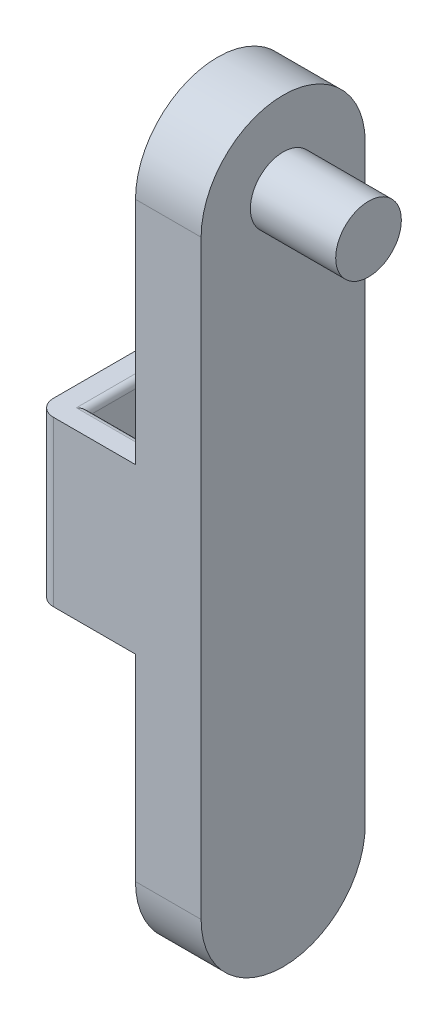
ISO-10303-21;
HEADER;
FILE_DESCRIPTION(('STEP AP214'),'2;1');
FILE_NAME('part.step','',(''),(''),'','','');
FILE_SCHEMA(('AUTOMOTIVE_DESIGN { 1 0 10303 214 1 1 1 1 }'));
ENDSEC;
DATA;
#1=APPLICATION_CONTEXT('core data for automotive mechanical design processes');
#2=APPLICATION_PROTOCOL_DEFINITION('international standard','automotive_design',2000,#1);
#3=PRODUCT_CONTEXT('',#1,'mechanical');
#4=PRODUCT('Part','Part','',(#3));
#5=PRODUCT_RELATED_PRODUCT_CATEGORY('part','',(#4));
#6=PRODUCT_DEFINITION_FORMATION('','',#4);
#7=PRODUCT_DEFINITION_CONTEXT('part definition',#1,'design');
#8=PRODUCT_DEFINITION('design','',#6,#7);
#9=PRODUCT_DEFINITION_SHAPE('','',#8);
#10=(LENGTH_UNIT() NAMED_UNIT(*) SI_UNIT(.MILLI.,.METRE.));
#11=(NAMED_UNIT(*) PLANE_ANGLE_UNIT() SI_UNIT($,.RADIAN.));
#12=(NAMED_UNIT(*) SI_UNIT($,.STERADIAN.) SOLID_ANGLE_UNIT());
#13=UNCERTAINTY_MEASURE_WITH_UNIT(LENGTH_MEASURE(1.E-05),#10,'distance_accuracy_value','');
#14=(GEOMETRIC_REPRESENTATION_CONTEXT(3) GLOBAL_UNCERTAINTY_ASSIGNED_CONTEXT((#13)) GLOBAL_UNIT_ASSIGNED_CONTEXT((#10,
#11,#12)) REPRESENTATION_CONTEXT('',''));
#15=CARTESIAN_POINT('',(0.,0.,0.));
#16=DIRECTION('',(0.,0.,1.));
#17=DIRECTION('',(1.,0.,0.));
#18=AXIS2_PLACEMENT_3D('',#15,#16,#17);
#19=CARTESIAN_POINT('',(0.,15.515536013207,14.7349061395775));
#20=DIRECTION('',(-1.,0.,0.));
#21=DIRECTION('',(0.,0.,1.));
#22=AXIS2_PLACEMENT_3D('',#19,#20,#21);
#23=PLANE('',#22);
#24=DIRECTION('',(0.,-1.,0.));
#25=VECTOR('',#24,1.);
#26=CARTESIAN_POINT('',(0.,15.515536013207,17.2349061395775));
#27=LINE('',#26,#25);
#28=CARTESIAN_POINT('',(0.,3.51553601320701,17.2349061395775));
#29=VERTEX_POINT('',#28);
#30=CARTESIAN_POINT('',(0.,-2.48446398679299,17.2349061395775));
#31=VERTEX_POINT('',#30);
#32=EDGE_CURVE('E218',#29,#31,#27,.T.);
#33=ORIENTED_EDGE('',*,*,#32,.F.);
#34=DIRECTION('',(0.,0.,-1.));
#35=VECTOR('',#34,1.);
#36=CARTESIAN_POINT('',(0.,3.51553601320701,23.0658580344228));
#37=LINE('',#36,#35);
#38=CARTESIAN_POINT('',(0.,3.51553601320701,12.2349061395775));
#39=VERTEX_POINT('',#38);
#40=EDGE_CURVE('E173',#29,#39,#37,.T.);
#41=ORIENTED_EDGE('',*,*,#40,.T.);
#42=DIRECTION('',(0.,1.,0.));
#43=VECTOR('',#42,1.);
#44=CARTESIAN_POINT('',(0.,15.515536013207,12.2349061395775));
#45=LINE('',#44,#43);
#46=CARTESIAN_POINT('',(0.,-2.48446398679299,12.2349061395775));
#47=VERTEX_POINT('',#46);
#48=EDGE_CURVE('E183',#47,#39,#45,.T.);
#49=ORIENTED_EDGE('',*,*,#48,.F.);
#50=CARTESIAN_POINT('',(0.,-2.48446398679299,14.7349061395775));
#51=DIRECTION('',(1.,0.,0.));
#52=DIRECTION('',(0.,0.,1.));
#53=AXIS2_PLACEMENT_3D('',#50,#51,#52);
#54=CIRCLE('',#53,2.5);
#55=EDGE_CURVE('E184',#31,#47,#54,.T.);
#56=ORIENTED_EDGE('',*,*,#55,.F.);
#57=EDGE_LOOP('',(#33,#41,#49,#56));
#58=FACE_BOUND('',#57,.T.);
#59=ADVANCED_FACE('F35',(#58),#23,.T.);
#60=CARTESIAN_POINT('',(2.,15.515536013207,14.7349061395775));
#61=DIRECTION('',(-1.,0.,0.));
#62=DIRECTION('',(0.,0.,1.));
#63=AXIS2_PLACEMENT_3D('',#60,#61,#62);
#64=CYLINDRICAL_SURFACE('',#63,2.5);
#65=CARTESIAN_POINT('',(0.,15.515536013207,14.7349061395775));
#66=DIRECTION('',(1.,0.,0.));
#67=DIRECTION('',(0.,0.,1.));
#68=AXIS2_PLACEMENT_3D('',#65,#66,#67);
#69=CIRCLE('',#68,2.5);
#70=CARTESIAN_POINT('',(0.,15.515536013207,12.2349061395775));
#71=VERTEX_POINT('',#70);
#72=CARTESIAN_POINT('',(0.,15.515536013207,17.2349061395775));
#73=VERTEX_POINT('',#72);
#74=EDGE_CURVE('E182',#71,#73,#69,.T.);
#75=ORIENTED_EDGE('',*,*,#74,.T.);
#76=DIRECTION('',(-1.,0.,0.));
#77=VECTOR('',#76,1.);
#78=CARTESIAN_POINT('',(2.,15.515536013207,17.2349061395775));
#79=LINE('',#78,#77);
#80=CARTESIAN_POINT('',(2.,15.515536013207,17.2349061395775));
#81=VERTEX_POINT('',#80);
#82=EDGE_CURVE('E230',#81,#73,#79,.T.);
#83=ORIENTED_EDGE('',*,*,#82,.F.);
#84=CARTESIAN_POINT('',(2.,15.515536013207,14.7349061395775));
#85=DIRECTION('',(1.,0.,0.));
#86=DIRECTION('',(0.,0.,1.));
#87=AXIS2_PLACEMENT_3D('',#84,#85,#86);
#88=CIRCLE('',#87,2.5);
#89=CARTESIAN_POINT('',(2.,15.515536013207,12.2349061395775));
#90=VERTEX_POINT('',#89);
#91=EDGE_CURVE('E207',#90,#81,#88,.T.);
#92=ORIENTED_EDGE('',*,*,#91,.F.);
#93=DIRECTION('',(-1.,0.,0.));
#94=VECTOR('',#93,1.);
#95=CARTESIAN_POINT('',(2.,15.515536013207,12.2349061395775));
#96=LINE('',#95,#94);
#97=EDGE_CURVE('E216',#90,#71,#96,.T.);
#98=ORIENTED_EDGE('',*,*,#97,.T.);
#99=EDGE_LOOP('',(#75,#83,#92,#98));
#100=FACE_BOUND('',#99,.T.);
#101=ADVANCED_FACE('F356',(#100),#64,.T.);
#102=CARTESIAN_POINT('',(2.,15.515536013207,17.2349061395775));
#103=DIRECTION('',(0.,0.,-1.));
#104=DIRECTION('',(-1.,0.,0.));
#105=AXIS2_PLACEMENT_3D('',#102,#103,#104);
#106=PLANE('',#105);
#107=DIRECTION('',(-1.,0.,0.));
#108=VECTOR('',#107,1.);
#109=CARTESIAN_POINT('',(0.,8.51553601320701,17.2349061395775));
#110=LINE('',#109,#108);
#111=CARTESIAN_POINT('',(0.,8.51553601320701,17.2349061395775));
#112=VERTEX_POINT('',#111);
#113=CARTESIAN_POINT('',(-2.5,8.51553601320701,17.2349061395775));
#114=VERTEX_POINT('',#113);
#115=EDGE_CURVE('E190',#112,#114,#110,.T.);
#116=ORIENTED_EDGE('',*,*,#115,.T.);
#117=DIRECTION('',(0.,-1.,0.));
#118=VECTOR('',#117,1.);
#119=CARTESIAN_POINT('',(-2.5,3.51553601320701,17.2349061395775));
#120=LINE('',#119,#118);
#121=CARTESIAN_POINT('',(-2.5,3.51553601320701,17.2349061395775));
#122=VERTEX_POINT('',#121);
#123=EDGE_CURVE('E236',#114,#122,#120,.T.);
#124=ORIENTED_EDGE('',*,*,#123,.T.);
#125=DIRECTION('',(1.,0.,0.));
#126=VECTOR('',#125,1.);
#127=CARTESIAN_POINT('',(0.,3.51553601320701,17.2349061395775));
#128=LINE('',#127,#126);
#129=EDGE_CURVE('E193',#122,#29,#128,.T.);
#130=ORIENTED_EDGE('',*,*,#129,.T.);
#131=ORIENTED_EDGE('',*,*,#32,.T.);
#132=DIRECTION('',(-1.,0.,0.));
#133=VECTOR('',#132,1.);
#134=CARTESIAN_POINT('',(2.,-2.48446398679299,17.2349061395775));
#135=LINE('',#134,#133);
#136=CARTESIAN_POINT('',(2.,-2.48446398679299,17.2349061395775));
#137=VERTEX_POINT('',#136);
#138=EDGE_CURVE('E227',#137,#31,#135,.T.);
#139=ORIENTED_EDGE('',*,*,#138,.F.);
#140=DIRECTION('',(0.,-1.,0.));
#141=VECTOR('',#140,1.);
#142=CARTESIAN_POINT('',(2.,15.515536013207,17.2349061395775));
#143=LINE('',#142,#141);
#144=EDGE_CURVE('E210',#81,#137,#143,.T.);
#145=ORIENTED_EDGE('',*,*,#144,.F.);
#146=ORIENTED_EDGE('',*,*,#82,.T.);
#147=EDGE_CURVE('E219',#73,#112,#27,.T.);
#148=ORIENTED_EDGE('',*,*,#147,.T.);
#149=EDGE_LOOP('',(#116,#124,#130,#131,#139,#145,#146,#148));
#150=FACE_BOUND('',#149,.T.);
#151=ADVANCED_FACE('F350',(#150),#106,.F.);
#152=CARTESIAN_POINT('',(2.,-2.48446398679299,14.7349061395775));
#153=DIRECTION('',(-1.,0.,0.));
#154=DIRECTION('',(0.,0.,1.));
#155=AXIS2_PLACEMENT_3D('',#152,#153,#154);
#156=CYLINDRICAL_SURFACE('',#155,2.5);
#157=ORIENTED_EDGE('',*,*,#55,.T.);
#158=DIRECTION('',(-1.,0.,0.));
#159=VECTOR('',#158,1.);
#160=CARTESIAN_POINT('',(2.,-2.48446398679299,12.2349061395775));
#161=LINE('',#160,#159);
#162=CARTESIAN_POINT('',(2.,-2.48446398679299,12.2349061395775));
#163=VERTEX_POINT('',#162);
#164=EDGE_CURVE('E224',#163,#47,#161,.T.);
#165=ORIENTED_EDGE('',*,*,#164,.F.);
#166=CARTESIAN_POINT('',(2.,-2.48446398679299,14.7349061395775));
#167=DIRECTION('',(1.,0.,0.));
#168=DIRECTION('',(0.,0.,1.));
#169=AXIS2_PLACEMENT_3D('',#166,#167,#168);
#170=CIRCLE('',#169,2.5);
#171=EDGE_CURVE('E212',#137,#163,#170,.T.);
#172=ORIENTED_EDGE('',*,*,#171,.F.);
#173=ORIENTED_EDGE('',*,*,#138,.T.);
#174=EDGE_LOOP('',(#157,#165,#172,#173));
#175=FACE_BOUND('',#174,.T.);
#176=ADVANCED_FACE('F363',(#175),#156,.T.);
#177=CARTESIAN_POINT('',(2.,15.515536013207,12.2349061395775));
#178=DIRECTION('',(0.,0.,1.));
#179=DIRECTION('',(0.,-1.,0.));
#180=AXIS2_PLACEMENT_3D('',#177,#178,#179);
#181=PLANE('',#180);
#182=DIRECTION('',(-1.,0.,0.));
#183=VECTOR('',#182,1.);
#184=CARTESIAN_POINT('',(0.,3.51553601320701,12.2349061395775));
#185=LINE('',#184,#183);
#186=CARTESIAN_POINT('',(-2.5,3.51553601320701,12.2349061395775));
#187=VERTEX_POINT('',#186);
#188=EDGE_CURVE('E174',#39,#187,#185,.T.);
#189=ORIENTED_EDGE('',*,*,#188,.T.);
#190=DIRECTION('',(0.,1.,0.));
#191=VECTOR('',#190,1.);
#192=CARTESIAN_POINT('',(-2.5,8.51553601320701,12.2349061395775));
#193=LINE('',#192,#191);
#194=CARTESIAN_POINT('',(-2.5,8.51553601320701,12.2349061395775));
#195=VERTEX_POINT('',#194);
#196=EDGE_CURVE('E170',#187,#195,#193,.T.);
#197=ORIENTED_EDGE('',*,*,#196,.T.);
#198=DIRECTION('',(1.,0.,0.));
#199=VECTOR('',#198,1.);
#200=CARTESIAN_POINT('',(0.,8.51553601320701,12.2349061395775));
#201=LINE('',#200,#199);
#202=CARTESIAN_POINT('',(0.,8.51553601320701,12.2349061395775));
#203=VERTEX_POINT('',#202);
#204=EDGE_CURVE('E162',#195,#203,#201,.T.);
#205=ORIENTED_EDGE('',*,*,#204,.T.);
#206=EDGE_CURVE('E167',#203,#71,#45,.T.);
#207=ORIENTED_EDGE('',*,*,#206,.T.);
#208=ORIENTED_EDGE('',*,*,#97,.F.);
#209=DIRECTION('',(0.,1.,0.));
#210=VECTOR('',#209,1.);
#211=CARTESIAN_POINT('',(2.,15.515536013207,12.2349061395775));
#212=LINE('',#211,#210);
#213=EDGE_CURVE('E214',#163,#90,#212,.T.);
#214=ORIENTED_EDGE('',*,*,#213,.F.);
#215=ORIENTED_EDGE('',*,*,#164,.T.);
#216=ORIENTED_EDGE('',*,*,#48,.T.);
#217=EDGE_LOOP('',(#189,#197,#205,#207,#208,#214,#215,#216));
#218=FACE_BOUND('',#217,.T.);
#219=ADVANCED_FACE('F165',(#218),#181,.F.);
#220=CARTESIAN_POINT('',(2.,15.515536013207,14.7349061395775));
#221=DIRECTION('',(-1.,0.,0.));
#222=DIRECTION('',(0.,0.,1.));
#223=AXIS2_PLACEMENT_3D('',#220,#221,#222);
#224=PLANE('',#223);
#225=CARTESIAN_POINT('',(2.,15.515536013207,14.7349061395775));
#226=DIRECTION('',(-1.,0.,0.));
#227=DIRECTION('',(0.,0.,1.));
#228=AXIS2_PLACEMENT_3D('',#225,#226,#227);
#229=CIRCLE('',#228,1.);
#230=CARTESIAN_POINT('',(2.,15.515536013207,15.7349061395775));
#231=VERTEX_POINT('',#230);
#232=EDGE_CURVE('E233',#231,#231,#229,.F.);
#233=ORIENTED_EDGE('',*,*,#232,.F.);
#234=EDGE_LOOP('',(#233));
#235=FACE_BOUND('',#234,.T.);
#236=ORIENTED_EDGE('',*,*,#91,.T.);
#237=ORIENTED_EDGE('',*,*,#144,.T.);
#238=ORIENTED_EDGE('',*,*,#171,.T.);
#239=ORIENTED_EDGE('',*,*,#213,.T.);
#240=EDGE_LOOP('',(#236,#237,#238,#239));
#241=FACE_BOUND('',#240,.T.);
#242=ADVANCED_FACE('F360',(#235,#241),#224,.F.);
#243=DIRECTION('',(0.,0.,-1.));
#244=VECTOR('',#243,1.);
#245=CARTESIAN_POINT('',(0.,8.51553601320701,23.0658580344228));
#246=LINE('',#245,#244);
#247=EDGE_CURVE('E179',#112,#203,#246,.T.);
#248=ORIENTED_EDGE('',*,*,#247,.F.);
#249=ORIENTED_EDGE('',*,*,#147,.F.);
#250=ORIENTED_EDGE('',*,*,#74,.F.);
#251=ORIENTED_EDGE('',*,*,#206,.F.);
#252=EDGE_LOOP('',(#248,#249,#250,#251));
#253=FACE_BOUND('',#252,.T.);
#254=ADVANCED_FACE('F178',(#253),#23,.T.);
#255=CARTESIAN_POINT('',(4.6,15.515536013207,14.7349061395775));
#256=DIRECTION('',(-1.,0.,0.));
#257=DIRECTION('',(0.,0.,1.));
#258=AXIS2_PLACEMENT_3D('',#255,#256,#257);
#259=CYLINDRICAL_SURFACE('',#258,1.);
#260=CARTESIAN_POINT('',(4.6,15.515536013207,14.7349061395775));
#261=DIRECTION('',(1.,0.,0.));
#262=DIRECTION('',(0.,0.,-1.));
#263=AXIS2_PLACEMENT_3D('',#260,#261,#262);
#264=CIRCLE('',#263,1.);
#265=CARTESIAN_POINT('',(4.6,15.515536013207,13.7349061395775));
#266=VERTEX_POINT('',#265);
#267=EDGE_CURVE('E204',#266,#266,#264,.T.);
#268=ORIENTED_EDGE('',*,*,#267,.F.);
#269=EDGE_LOOP('',(#268));
#270=FACE_BOUND('',#269,.T.);
#271=ORIENTED_EDGE('',*,*,#232,.T.);
#272=EDGE_LOOP('',(#271));
#273=FACE_BOUND('',#272,.T.);
#274=ADVANCED_FACE('F390',(#270,#273),#259,.T.);
#275=CARTESIAN_POINT('',(4.6,15.515536013207,14.7349061395775));
#276=DIRECTION('',(1.,0.,0.));
#277=DIRECTION('',(0.,0.,-1.));
#278=AXIS2_PLACEMENT_3D('',#275,#276,#277);
#279=PLANE('',#278);
#280=ORIENTED_EDGE('',*,*,#267,.T.);
#281=EDGE_LOOP('',(#280));
#282=FACE_BOUND('',#281,.T.);
#283=ADVANCED_FACE('F395',(#282),#279,.T.);
#284=CARTESIAN_POINT('',(0.,8.51553601320701,23.0658580344228));
#285=DIRECTION('',(0.,1.,0.));
#286=DIRECTION('',(0.,0.,1.));
#287=AXIS2_PLACEMENT_3D('',#284,#285,#286);
#288=PLANE('',#287);
#289=DIRECTION('',(1.,0.,0.));
#290=VECTOR('',#289,1.);
#291=CARTESIAN_POINT('',(-2.2,8.51553601320701,16.6349061395775));
#292=LINE('',#291,#290);
#293=CARTESIAN_POINT('',(-0.6,8.51553601320701,16.6349061395775));
#294=VERTEX_POINT('',#293);
#295=CARTESIAN_POINT('',(-2.4,8.51553601320701,16.6349061395775));
#296=VERTEX_POINT('',#295);
#297=EDGE_CURVE('E44',#294,#296,#292,.F.);
#298=ORIENTED_EDGE('',*,*,#297,.T.);
#299=DIRECTION('',(0.,0.,1.));
#300=VECTOR('',#299,1.);
#301=CARTESIAN_POINT('',(-2.4,8.51553601320701,13.0349061395775));
#302=LINE('',#301,#300);
#303=CARTESIAN_POINT('',(-2.4,8.51553601320701,12.8349061395775));
#304=VERTEX_POINT('',#303);
#305=EDGE_CURVE('E11',#296,#304,#302,.F.);
#306=ORIENTED_EDGE('',*,*,#305,.T.);
#307=DIRECTION('',(-1.,0.,0.));
#308=VECTOR('',#307,1.);
#309=CARTESIAN_POINT('',(-0.8,8.51553601320701,12.8349061395775));
#310=LINE('',#309,#308);
#311=CARTESIAN_POINT('',(-0.6,8.51553601320701,12.8349061395775));
#312=VERTEX_POINT('',#311);
#313=EDGE_CURVE('E281',#304,#312,#310,.F.);
#314=ORIENTED_EDGE('',*,*,#313,.T.);
#315=DIRECTION('',(0.,0.,-1.));
#316=VECTOR('',#315,1.);
#317=CARTESIAN_POINT('',(-0.6,8.51553601320701,16.4349061395775));
#318=LINE('',#317,#316);
#319=EDGE_CURVE('E279',#312,#294,#318,.F.);
#320=ORIENTED_EDGE('',*,*,#319,.T.);
#321=EDGE_LOOP('',(#298,#306,#314,#320));
#322=FACE_BOUND('',#321,.T.);
#323=DIRECTION('',(0.,0.,-1.));
#324=VECTOR('',#323,1.);
#325=CARTESIAN_POINT('',(-3.,8.51553601320701,23.0658580344228));
#326=LINE('',#325,#324);
#327=CARTESIAN_POINT('',(-3.,8.51553601320701,16.7349061395775));
#328=VERTEX_POINT('',#327);
#329=CARTESIAN_POINT('',(-3.,8.51553601320701,12.7349061395775));
#330=VERTEX_POINT('',#329);
#331=EDGE_CURVE('E191',#328,#330,#326,.T.);
#332=ORIENTED_EDGE('',*,*,#331,.F.);
#333=CARTESIAN_POINT('',(-2.5,8.51553601320701,16.7349061395775));
#334=DIRECTION('',(0.,1.,0.));
#335=DIRECTION('',(0.,0.,1.));
#336=AXIS2_PLACEMENT_3D('',#333,#334,#335);
#337=CIRCLE('',#336,0.5);
#338=EDGE_CURVE('E249',#328,#114,#337,.T.);
#339=ORIENTED_EDGE('',*,*,#338,.T.);
#340=ORIENTED_EDGE('',*,*,#115,.F.);
#341=ORIENTED_EDGE('',*,*,#247,.T.);
#342=ORIENTED_EDGE('',*,*,#204,.F.);
#343=CARTESIAN_POINT('',(-2.5,8.51553601320701,12.7349061395775));
#344=DIRECTION('',(0.,1.,0.));
#345=DIRECTION('',(0.,0.,1.));
#346=AXIS2_PLACEMENT_3D('',#343,#344,#345);
#347=CIRCLE('',#346,0.5);
#348=EDGE_CURVE('E247',#195,#330,#347,.T.);
#349=ORIENTED_EDGE('',*,*,#348,.T.);
#350=EDGE_LOOP('',(#332,#339,#340,#341,#342,#349));
#351=FACE_BOUND('',#350,.T.);
#352=ADVANCED_FACE('F188',(#322,#351),#288,.T.);
#353=CARTESIAN_POINT('',(-3.,8.51553601320701,23.0658580344228));
#354=DIRECTION('',(-1.,0.,0.));
#355=DIRECTION('',(0.,0.,1.));
#356=AXIS2_PLACEMENT_3D('',#353,#354,#355);
#357=PLANE('',#356);
#358=DIRECTION('',(0.,0.,-1.));
#359=VECTOR('',#358,1.);
#360=CARTESIAN_POINT('',(-3.,3.51553601320701,23.0658580344228));
#361=LINE('',#360,#359);
#362=CARTESIAN_POINT('',(-3.,3.51553601320701,16.7349061395775));
#363=VERTEX_POINT('',#362);
#364=CARTESIAN_POINT('',(-3.,3.51553601320701,12.7349061395775));
#365=VERTEX_POINT('',#364);
#366=EDGE_CURVE('E196',#363,#365,#361,.T.);
#367=ORIENTED_EDGE('',*,*,#366,.F.);
#368=DIRECTION('',(0.,-1.,0.));
#369=VECTOR('',#368,1.);
#370=CARTESIAN_POINT('',(-3.,8.51553601320701,16.7349061395775));
#371=LINE('',#370,#369);
#372=EDGE_CURVE('E245',#363,#328,#371,.F.);
#373=ORIENTED_EDGE('',*,*,#372,.T.);
#374=ORIENTED_EDGE('',*,*,#331,.T.);
#375=DIRECTION('',(0.,1.,0.));
#376=VECTOR('',#375,1.);
#377=CARTESIAN_POINT('',(-3.,3.51553601320701,12.7349061395775));
#378=LINE('',#377,#376);
#379=EDGE_CURVE('E243',#330,#365,#378,.F.);
#380=ORIENTED_EDGE('',*,*,#379,.T.);
#381=EDGE_LOOP('',(#367,#373,#374,#380));
#382=FACE_BOUND('',#381,.T.);
#383=ADVANCED_FACE('F344',(#382),#357,.T.);
#384=CARTESIAN_POINT('',(0.,3.51553601320701,23.0658580344228));
#385=DIRECTION('',(0.,-1.,0.));
#386=DIRECTION('',(0.,0.,-1.));
#387=AXIS2_PLACEMENT_3D('',#384,#385,#386);
#388=PLANE('',#387);
#389=DIRECTION('',(0.,0.,1.));
#390=VECTOR('',#389,1.);
#391=CARTESIAN_POINT('',(-0.6,3.51553601320701,13.0349061395775));
#392=LINE('',#391,#390);
#393=CARTESIAN_POINT('',(-0.6,3.51553601320701,16.6349061395775));
#394=VERTEX_POINT('',#393);
#395=CARTESIAN_POINT('',(-0.6,3.51553601320701,12.8349061395775));
#396=VERTEX_POINT('',#395);
#397=EDGE_CURVE('E257',#394,#396,#392,.F.);
#398=ORIENTED_EDGE('',*,*,#397,.T.);
#399=DIRECTION('',(1.,0.,0.));
#400=VECTOR('',#399,1.);
#401=CARTESIAN_POINT('',(-2.2,3.51553601320701,12.8349061395775));
#402=LINE('',#401,#400);
#403=CARTESIAN_POINT('',(-2.4,3.51553601320701,12.8349061395775));
#404=VERTEX_POINT('',#403);
#405=EDGE_CURVE('E263',#396,#404,#402,.F.);
#406=ORIENTED_EDGE('',*,*,#405,.T.);
#407=DIRECTION('',(0.,0.,-1.));
#408=VECTOR('',#407,1.);
#409=CARTESIAN_POINT('',(-2.4,3.51553601320701,16.4349061395775));
#410=LINE('',#409,#408);
#411=CARTESIAN_POINT('',(-2.4,3.51553601320701,16.6349061395775));
#412=VERTEX_POINT('',#411);
#413=EDGE_CURVE('E261',#404,#412,#410,.F.);
#414=ORIENTED_EDGE('',*,*,#413,.T.);
#415=DIRECTION('',(-1.,0.,0.));
#416=VECTOR('',#415,1.);
#417=CARTESIAN_POINT('',(-0.8,3.51553601320701,16.6349061395775));
#418=LINE('',#417,#416);
#419=EDGE_CURVE('E259',#412,#394,#418,.F.);
#420=ORIENTED_EDGE('',*,*,#419,.T.);
#421=EDGE_LOOP('',(#398,#406,#414,#420));
#422=FACE_BOUND('',#421,.T.);
#423=ORIENTED_EDGE('',*,*,#129,.F.);
#424=CARTESIAN_POINT('',(-2.5,3.51553601320701,16.7349061395775));
#425=DIRECTION('',(0.,-1.,0.));
#426=DIRECTION('',(0.,0.,-1.));
#427=AXIS2_PLACEMENT_3D('',#424,#425,#426);
#428=CIRCLE('',#427,0.5);
#429=EDGE_CURVE('E241',#122,#363,#428,.T.);
#430=ORIENTED_EDGE('',*,*,#429,.T.);
#431=ORIENTED_EDGE('',*,*,#366,.T.);
#432=CARTESIAN_POINT('',(-2.5,3.51553601320701,12.7349061395775));
#433=DIRECTION('',(0.,-1.,0.));
#434=DIRECTION('',(0.,0.,-1.));
#435=AXIS2_PLACEMENT_3D('',#432,#433,#434);
#436=CIRCLE('',#435,0.5);
#437=EDGE_CURVE('E239',#365,#187,#436,.T.);
#438=ORIENTED_EDGE('',*,*,#437,.T.);
#439=ORIENTED_EDGE('',*,*,#188,.F.);
#440=ORIENTED_EDGE('',*,*,#40,.F.);
#441=EDGE_LOOP('',(#423,#430,#431,#438,#439,#440));
#442=FACE_BOUND('',#441,.T.);
#443=ADVANCED_FACE('F367',(#422,#442),#388,.T.);
#444=CARTESIAN_POINT('',(-0.8,-4.98446398679299,16.4349061395775));
#445=DIRECTION('',(1.,0.,0.));
#446=DIRECTION('',(0.,0.,-1.));
#447=AXIS2_PLACEMENT_3D('',#444,#445,#446);
#448=PLANE('',#447);
#449=DIRECTION('',(0.,1.,0.));
#450=VECTOR('',#449,1.);
#451=CARTESIAN_POINT('',(-0.8,-4.98446398679299,13.0349061395775));
#452=LINE('',#451,#450);
#453=CARTESIAN_POINT('',(-0.8,3.71553601320701,13.0349061395775));
#454=VERTEX_POINT('',#453);
#455=CARTESIAN_POINT('',(-0.8,8.31553601320701,13.0349061395775));
#456=VERTEX_POINT('',#455);
#457=EDGE_CURVE('E294',#454,#456,#452,.T.);
#458=ORIENTED_EDGE('',*,*,#457,.F.);
#459=DIRECTION('',(0.,0.,1.));
#460=VECTOR('',#459,1.);
#461=CARTESIAN_POINT('',(-0.8,3.71553601320701,16.4349061395775));
#462=LINE('',#461,#460);
#463=CARTESIAN_POINT('',(-0.8,3.71553601320701,16.4349061395775));
#464=VERTEX_POINT('',#463);
#465=EDGE_CURVE('E277',#454,#464,#462,.T.);
#466=ORIENTED_EDGE('',*,*,#465,.T.);
#467=DIRECTION('',(0.,1.,0.));
#468=VECTOR('',#467,1.);
#469=CARTESIAN_POINT('',(-0.8,-4.98446398679299,16.4349061395775));
#470=LINE('',#469,#468);
#471=CARTESIAN_POINT('',(-0.8,8.31553601320701,16.4349061395775));
#472=VERTEX_POINT('',#471);
#473=EDGE_CURVE('E327',#464,#472,#470,.T.);
#474=ORIENTED_EDGE('',*,*,#473,.T.);
#475=DIRECTION('',(0.,0.,-1.));
#476=VECTOR('',#475,1.);
#477=CARTESIAN_POINT('',(-0.8,8.31553601320701,13.0349061395775));
#478=LINE('',#477,#476);
#479=EDGE_CURVE('E275',#472,#456,#478,.T.);
#480=ORIENTED_EDGE('',*,*,#479,.T.);
#481=EDGE_LOOP('',(#458,#466,#474,#480));
#482=FACE_BOUND('',#481,.T.);
#483=ADVANCED_FACE('F369',(#482),#448,.F.);
#484=CARTESIAN_POINT('',(-0.8,-4.98446398679299,16.4349061395775));
#485=DIRECTION('',(0.,0.,1.));
#486=DIRECTION('',(0.,-1.,0.));
#487=AXIS2_PLACEMENT_3D('',#484,#485,#486);
#488=PLANE('',#487);
#489=ORIENTED_EDGE('',*,*,#473,.F.);
#490=DIRECTION('',(-1.,0.,0.));
#491=VECTOR('',#490,1.);
#492=CARTESIAN_POINT('',(-2.2,3.71553601320701,16.4349061395775));
#493=LINE('',#492,#491);
#494=CARTESIAN_POINT('',(-2.2,3.71553601320701,16.4349061395775));
#495=VERTEX_POINT('',#494);
#496=EDGE_CURVE('E273',#464,#495,#493,.T.);
#497=ORIENTED_EDGE('',*,*,#496,.T.);
#498=DIRECTION('',(0.,1.,0.));
#499=VECTOR('',#498,1.);
#500=CARTESIAN_POINT('',(-2.2,-4.98446398679299,16.4349061395775));
#501=LINE('',#500,#499);
#502=CARTESIAN_POINT('',(-2.2,8.31553601320701,16.4349061395775));
#503=VERTEX_POINT('',#502);
#504=EDGE_CURVE('E321',#495,#503,#501,.T.);
#505=ORIENTED_EDGE('',*,*,#504,.T.);
#506=DIRECTION('',(1.,0.,0.));
#507=VECTOR('',#506,1.);
#508=CARTESIAN_POINT('',(-0.8,8.31553601320701,16.4349061395775));
#509=LINE('',#508,#507);
#510=EDGE_CURVE('E271',#503,#472,#509,.T.);
#511=ORIENTED_EDGE('',*,*,#510,.T.);
#512=EDGE_LOOP('',(#489,#497,#505,#511));
#513=FACE_BOUND('',#512,.T.);
#514=ADVANCED_FACE('F325',(#513),#488,.F.);
#515=CARTESIAN_POINT('',(-2.2,-4.98446398679299,16.4349061395775));
#516=DIRECTION('',(-1.,0.,0.));
#517=DIRECTION('',(0.,0.,1.));
#518=AXIS2_PLACEMENT_3D('',#515,#516,#517);
#519=PLANE('',#518);
#520=ORIENTED_EDGE('',*,*,#504,.F.);
#521=DIRECTION('',(0.,0.,-1.));
#522=VECTOR('',#521,1.);
#523=CARTESIAN_POINT('',(-2.2,3.71553601320701,13.0349061395775));
#524=LINE('',#523,#522);
#525=CARTESIAN_POINT('',(-2.2,3.71553601320701,13.0349061395775));
#526=VERTEX_POINT('',#525);
#527=EDGE_CURVE('E269',#495,#526,#524,.T.);
#528=ORIENTED_EDGE('',*,*,#527,.T.);
#529=DIRECTION('',(0.,1.,0.));
#530=VECTOR('',#529,1.);
#531=CARTESIAN_POINT('',(-2.2,-4.98446398679299,13.0349061395775));
#532=LINE('',#531,#530);
#533=CARTESIAN_POINT('',(-2.2,8.31553601320701,13.0349061395775));
#534=VERTEX_POINT('',#533);
#535=EDGE_CURVE('E324',#526,#534,#532,.T.);
#536=ORIENTED_EDGE('',*,*,#535,.T.);
#537=DIRECTION('',(0.,0.,1.));
#538=VECTOR('',#537,1.);
#539=CARTESIAN_POINT('',(-2.2,8.31553601320701,16.4349061395775));
#540=LINE('',#539,#538);
#541=EDGE_CURVE('E266',#534,#503,#540,.T.);
#542=ORIENTED_EDGE('',*,*,#541,.T.);
#543=EDGE_LOOP('',(#520,#528,#536,#542));
#544=FACE_BOUND('',#543,.T.);
#545=ADVANCED_FACE('F320',(#544),#519,.F.);
#546=CARTESIAN_POINT('',(-0.8,-4.98446398679299,13.0349061395775));
#547=DIRECTION('',(0.,0.,-1.));
#548=DIRECTION('',(0.,1.,0.));
#549=AXIS2_PLACEMENT_3D('',#546,#547,#548);
#550=PLANE('',#549);
#551=ORIENTED_EDGE('',*,*,#535,.F.);
#552=DIRECTION('',(1.,0.,0.));
#553=VECTOR('',#552,1.);
#554=CARTESIAN_POINT('',(-0.8,3.71553601320701,13.0349061395775));
#555=LINE('',#554,#553);
#556=EDGE_CURVE('E254',#526,#454,#555,.T.);
#557=ORIENTED_EDGE('',*,*,#556,.T.);
#558=ORIENTED_EDGE('',*,*,#457,.T.);
#559=DIRECTION('',(-1.,0.,0.));
#560=VECTOR('',#559,1.);
#561=CARTESIAN_POINT('',(-2.2,8.31553601320701,13.0349061395775));
#562=LINE('',#561,#560);
#563=EDGE_CURVE('E252',#456,#534,#562,.T.);
#564=ORIENTED_EDGE('',*,*,#563,.T.);
#565=EDGE_LOOP('',(#551,#557,#558,#564));
#566=FACE_BOUND('',#565,.T.);
#567=ADVANCED_FACE('F415',(#566),#550,.F.);
#568=CARTESIAN_POINT('',(-2.5,15.515536013207,16.7349061395775));
#569=DIRECTION('',(0.,1.,0.));
#570=DIRECTION('',(0.,0.,1.));
#571=AXIS2_PLACEMENT_3D('',#568,#569,#570);
#572=CYLINDRICAL_SURFACE('',#571,0.5);
#573=ORIENTED_EDGE('',*,*,#338,.F.);
#574=ORIENTED_EDGE('',*,*,#372,.F.);
#575=ORIENTED_EDGE('',*,*,#429,.F.);
#576=ORIENTED_EDGE('',*,*,#123,.F.);
#577=EDGE_LOOP('',(#573,#574,#575,#576));
#578=FACE_BOUND('',#577,.T.);
#579=ADVANCED_FACE('F347',(#578),#572,.T.);
#580=CARTESIAN_POINT('',(-2.5,15.515536013207,12.7349061395775));
#581=DIRECTION('',(0.,-1.,0.));
#582=DIRECTION('',(0.,0.,-1.));
#583=AXIS2_PLACEMENT_3D('',#580,#581,#582);
#584=CYLINDRICAL_SURFACE('',#583,0.5);
#585=ORIENTED_EDGE('',*,*,#437,.F.);
#586=ORIENTED_EDGE('',*,*,#379,.F.);
#587=ORIENTED_EDGE('',*,*,#348,.F.);
#588=ORIENTED_EDGE('',*,*,#196,.F.);
#589=EDGE_LOOP('',(#585,#586,#587,#588));
#590=FACE_BOUND('',#589,.T.);
#591=ADVANCED_FACE('F339',(#590),#584,.T.);
#592=CARTESIAN_POINT('',(-0.8,3.71553601320701,16.6349061395775));
#593=DIRECTION('',(1.,0.,0.));
#594=DIRECTION('',(0.,0.,-1.));
#595=AXIS2_PLACEMENT_3D('',#592,#593,#594);
#596=CYLINDRICAL_SURFACE('',#595,0.2);
#597=CARTESIAN_POINT('',(-0.6,3.71553601320701,16.6349061395775));
#598=DIRECTION('',(0.707106781186547,0.,-0.707106781186547));
#599=DIRECTION('',(0.707106781186547,0.,0.707106781186547));
#600=AXIS2_PLACEMENT_3D('',#597,#598,#599);
#601=ELLIPSE('',#600,0.282842712474619,0.2);
#602=EDGE_CURVE('E288',#394,#464,#601,.T.);
#603=ORIENTED_EDGE('',*,*,#602,.F.);
#604=ORIENTED_EDGE('',*,*,#419,.F.);
#605=CARTESIAN_POINT('',(-2.4,3.71553601320701,16.6349061395775));
#606=DIRECTION('',(0.707106781186547,0.,0.707106781186547));
#607=DIRECTION('',(-0.707106781186547,0.,0.707106781186547));
#608=AXIS2_PLACEMENT_3D('',#605,#606,#607);
#609=ELLIPSE('',#608,0.282842712474619,0.2);
#610=EDGE_CURVE('E291',#495,#412,#609,.F.);
#611=ORIENTED_EDGE('',*,*,#610,.F.);
#612=ORIENTED_EDGE('',*,*,#496,.F.);
#613=EDGE_LOOP('',(#603,#604,#611,#612));
#614=FACE_BOUND('',#613,.T.);
#615=ADVANCED_FACE('F448',(#614),#596,.T.);
#616=CARTESIAN_POINT('',(-2.4,3.71553601320701,16.4349061395775));
#617=DIRECTION('',(0.,0.,1.));
#618=DIRECTION('',(0.,-1.,0.));
#619=AXIS2_PLACEMENT_3D('',#616,#617,#618);
#620=CYLINDRICAL_SURFACE('',#619,0.2);
#621=ORIENTED_EDGE('',*,*,#610,.T.);
#622=ORIENTED_EDGE('',*,*,#413,.F.);
#623=CARTESIAN_POINT('',(-2.4,3.71553601320701,12.8349061395775));
#624=DIRECTION('',(-0.707106781186547,0.,0.707106781186547));
#625=DIRECTION('',(-0.707106781186547,0.,-0.707106781186547));
#626=AXIS2_PLACEMENT_3D('',#623,#624,#625);
#627=ELLIPSE('',#626,0.282842712474619,0.2);
#628=EDGE_CURVE('E286',#526,#404,#627,.F.);
#629=ORIENTED_EDGE('',*,*,#628,.F.);
#630=ORIENTED_EDGE('',*,*,#527,.F.);
#631=EDGE_LOOP('',(#621,#622,#629,#630));
#632=FACE_BOUND('',#631,.T.);
#633=ADVANCED_FACE('F454',(#632),#620,.T.);
#634=CARTESIAN_POINT('',(-0.6,3.71553601320701,16.4349061395775));
#635=DIRECTION('',(0.,0.,-1.));
#636=DIRECTION('',(0.,1.,0.));
#637=AXIS2_PLACEMENT_3D('',#634,#635,#636);
#638=CYLINDRICAL_SURFACE('',#637,0.2);
#639=ORIENTED_EDGE('',*,*,#602,.T.);
#640=ORIENTED_EDGE('',*,*,#465,.F.);
#641=CARTESIAN_POINT('',(-0.6,3.71553601320701,12.8349061395775));
#642=DIRECTION('',(-0.707106781186547,0.,-0.707106781186547));
#643=DIRECTION('',(-0.707106781186547,0.,0.707106781186547));
#644=AXIS2_PLACEMENT_3D('',#641,#642,#643);
#645=ELLIPSE('',#644,0.282842712474619,0.2);
#646=EDGE_CURVE('E284',#396,#454,#645,.T.);
#647=ORIENTED_EDGE('',*,*,#646,.F.);
#648=ORIENTED_EDGE('',*,*,#397,.F.);
#649=EDGE_LOOP('',(#639,#640,#647,#648));
#650=FACE_BOUND('',#649,.T.);
#651=ADVANCED_FACE('F462',(#650),#638,.T.);
#652=CARTESIAN_POINT('',(-0.8,3.71553601320701,12.8349061395775));
#653=DIRECTION('',(-1.,0.,0.));
#654=DIRECTION('',(0.,0.,1.));
#655=AXIS2_PLACEMENT_3D('',#652,#653,#654);
#656=CYLINDRICAL_SURFACE('',#655,0.2);
#657=ORIENTED_EDGE('',*,*,#628,.T.);
#658=ORIENTED_EDGE('',*,*,#405,.F.);
#659=ORIENTED_EDGE('',*,*,#646,.T.);
#660=ORIENTED_EDGE('',*,*,#556,.F.);
#661=EDGE_LOOP('',(#657,#658,#659,#660));
#662=FACE_BOUND('',#661,.T.);
#663=ADVANCED_FACE('F470',(#662),#656,.T.);
#664=CARTESIAN_POINT('',(-0.6,8.31553601320701,16.4349061395775));
#665=DIRECTION('',(0.,0.,1.));
#666=DIRECTION('',(0.,-1.,0.));
#667=AXIS2_PLACEMENT_3D('',#664,#665,#666);
#668=CYLINDRICAL_SURFACE('',#667,0.2);
#669=CARTESIAN_POINT('',(-0.6,8.31553601320701,16.6349061395775));
#670=DIRECTION('',(-0.707106781186547,0.,0.707106781186547));
#671=DIRECTION('',(-0.707106781186547,0.,-0.707106781186547));
#672=AXIS2_PLACEMENT_3D('',#669,#670,#671);
#673=ELLIPSE('',#672,0.282842712474619,0.2);
#674=EDGE_CURVE('E297',#294,#472,#673,.T.);
#675=ORIENTED_EDGE('',*,*,#674,.F.);
#676=ORIENTED_EDGE('',*,*,#319,.F.);
#677=CARTESIAN_POINT('',(-0.6,8.31553601320701,12.8349061395775));
#678=DIRECTION('',(0.707106781186547,0.,0.707106781186547));
#679=DIRECTION('',(0.707106781186547,0.,-0.707106781186547));
#680=AXIS2_PLACEMENT_3D('',#677,#678,#679);
#681=ELLIPSE('',#680,0.282842712474619,0.2);
#682=EDGE_CURVE('E39',#456,#312,#681,.F.);
#683=ORIENTED_EDGE('',*,*,#682,.F.);
#684=ORIENTED_EDGE('',*,*,#479,.F.);
#685=EDGE_LOOP('',(#675,#676,#683,#684));
#686=FACE_BOUND('',#685,.T.);
#687=ADVANCED_FACE('F37',(#686),#668,.T.);
#688=CARTESIAN_POINT('',(-0.8,8.31553601320701,12.8349061395775));
#689=DIRECTION('',(1.,0.,0.));
#690=DIRECTION('',(0.,0.,-1.));
#691=AXIS2_PLACEMENT_3D('',#688,#689,#690);
#692=CYLINDRICAL_SURFACE('',#691,0.2);
#693=ORIENTED_EDGE('',*,*,#682,.T.);
#694=ORIENTED_EDGE('',*,*,#313,.F.);
#695=CARTESIAN_POINT('',(-2.4,8.31553601320701,12.8349061395775));
#696=DIRECTION('',(0.707106781186547,0.,-0.707106781186547));
#697=DIRECTION('',(-0.707106781186547,0.,-0.707106781186547));
#698=AXIS2_PLACEMENT_3D('',#695,#696,#697);
#699=ELLIPSE('',#698,0.282842712474619,0.2);
#700=EDGE_CURVE('E57',#534,#304,#699,.F.);
#701=ORIENTED_EDGE('',*,*,#700,.F.);
#702=ORIENTED_EDGE('',*,*,#563,.F.);
#703=EDGE_LOOP('',(#693,#694,#701,#702));
#704=FACE_BOUND('',#703,.T.);
#705=ADVANCED_FACE('F306',(#704),#692,.T.);
#706=CARTESIAN_POINT('',(-0.8,8.31553601320701,16.6349061395775));
#707=DIRECTION('',(-1.,0.,0.));
#708=DIRECTION('',(0.,0.,1.));
#709=AXIS2_PLACEMENT_3D('',#706,#707,#708);
#710=CYLINDRICAL_SURFACE('',#709,0.2);
#711=ORIENTED_EDGE('',*,*,#674,.T.);
#712=ORIENTED_EDGE('',*,*,#510,.F.);
#713=CARTESIAN_POINT('',(-2.4,8.31553601320701,16.6349061395775));
#714=DIRECTION('',(-0.707106781186547,0.,-0.707106781186547));
#715=DIRECTION('',(0.707106781186547,0.,-0.707106781186547));
#716=AXIS2_PLACEMENT_3D('',#713,#714,#715);
#717=ELLIPSE('',#716,0.282842712474619,0.2);
#718=EDGE_CURVE('E295',#296,#503,#717,.T.);
#719=ORIENTED_EDGE('',*,*,#718,.F.);
#720=ORIENTED_EDGE('',*,*,#297,.F.);
#721=EDGE_LOOP('',(#711,#712,#719,#720));
#722=FACE_BOUND('',#721,.T.);
#723=ADVANCED_FACE('F312',(#722),#710,.T.);
#724=CARTESIAN_POINT('',(-2.4,8.31553601320701,16.4349061395775));
#725=DIRECTION('',(0.,0.,-1.));
#726=DIRECTION('',(0.,1.,0.));
#727=AXIS2_PLACEMENT_3D('',#724,#725,#726);
#728=CYLINDRICAL_SURFACE('',#727,0.2);
#729=ORIENTED_EDGE('',*,*,#700,.T.);
#730=ORIENTED_EDGE('',*,*,#305,.F.);
#731=ORIENTED_EDGE('',*,*,#718,.T.);
#732=ORIENTED_EDGE('',*,*,#541,.F.);
#733=EDGE_LOOP('',(#729,#730,#731,#732));
#734=FACE_BOUND('',#733,.T.);
#735=ADVANCED_FACE('F311',(#734),#728,.T.);
#736=CLOSED_SHELL('',(#59,#101,#151,#176,#219,#242,#254,#274,#283,#352,#383,#443,#483,#514,#545,
#567,#579,#591,#615,#633,#651,#663,#687,#705,#723,#735));
#737=MANIFOLD_SOLID_BREP('B2',#736);
#738=ADVANCED_BREP_SHAPE_REPRESENTATION('',(#18,#737),#14);
#739=SHAPE_DEFINITION_REPRESENTATION(#9,#738);
ENDSEC;
END-ISO-10303-21;
